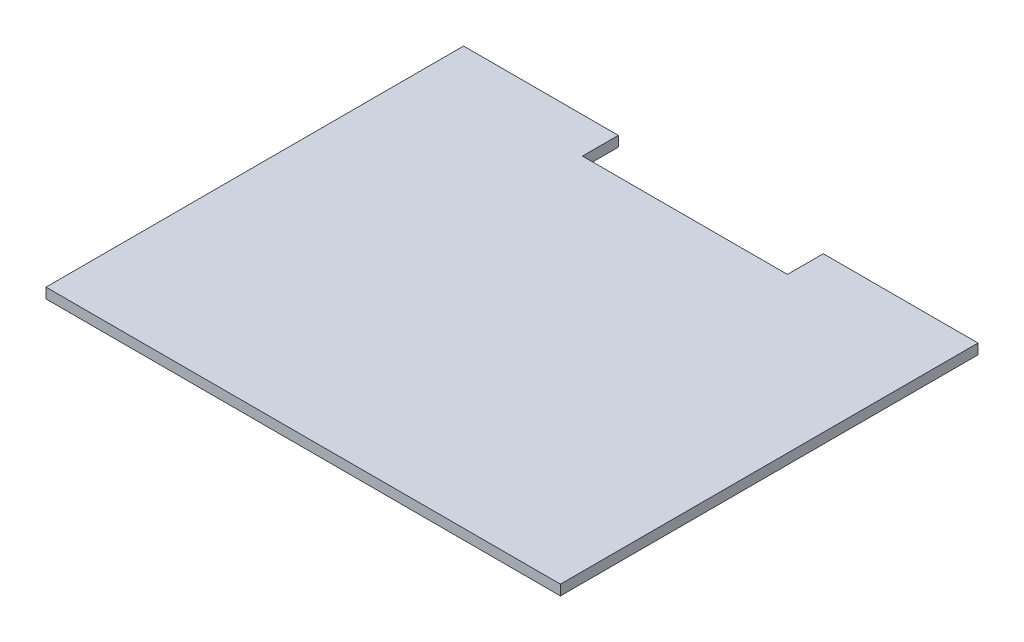
ISO-10303-21;
HEADER;
FILE_DESCRIPTION(('STEP AP214'),'2;1');
FILE_NAME('part.step','',(''),(''),'','','');
FILE_SCHEMA(('AUTOMOTIVE_DESIGN { 1 0 10303 214 1 1 1 1 }'));
ENDSEC;
DATA;
#1=APPLICATION_CONTEXT('core data for automotive mechanical design processes');
#2=APPLICATION_PROTOCOL_DEFINITION('international standard','automotive_design',2000,#1);
#3=PRODUCT_CONTEXT('',#1,'mechanical');
#4=PRODUCT('Part','Part','',(#3));
#5=PRODUCT_RELATED_PRODUCT_CATEGORY('part','',(#4));
#6=PRODUCT_DEFINITION_FORMATION('','',#4);
#7=PRODUCT_DEFINITION_CONTEXT('part definition',#1,'design');
#8=PRODUCT_DEFINITION('design','',#6,#7);
#9=PRODUCT_DEFINITION_SHAPE('','',#8);
#10=(LENGTH_UNIT() NAMED_UNIT(*) SI_UNIT(.MILLI.,.METRE.));
#11=(NAMED_UNIT(*) PLANE_ANGLE_UNIT() SI_UNIT($,.RADIAN.));
#12=(NAMED_UNIT(*) SI_UNIT($,.STERADIAN.) SOLID_ANGLE_UNIT());
#13=UNCERTAINTY_MEASURE_WITH_UNIT(LENGTH_MEASURE(1.E-05),#10,'distance_accuracy_value','');
#14=(GEOMETRIC_REPRESENTATION_CONTEXT(3) GLOBAL_UNCERTAINTY_ASSIGNED_CONTEXT((#13)) GLOBAL_UNIT_ASSIGNED_CONTEXT((#10,
#11,#12)) REPRESENTATION_CONTEXT('',''));
#15=CARTESIAN_POINT('',(0.,0.,0.));
#16=DIRECTION('',(0.,0.,1.));
#17=DIRECTION('',(1.,0.,0.));
#18=AXIS2_PLACEMENT_3D('',#15,#16,#17);
#19=CARTESIAN_POINT('',(50.2,0.,0.));
#20=DIRECTION('',(1.,0.,0.));
#21=DIRECTION('',(0.,1.,0.));
#22=AXIS2_PLACEMENT_3D('',#19,#20,#21);
#23=PLANE('',#22);
#24=DIRECTION('',(0.,0.,1.));
#25=VECTOR('',#24,1.);
#26=CARTESIAN_POINT('',(50.2,0.,0.));
#27=LINE('',#26,#25);
#28=CARTESIAN_POINT('',(50.2,0.,0.));
#29=VERTEX_POINT('',#28);
#30=CARTESIAN_POINT('',(50.2,0.,81.5));
#31=VERTEX_POINT('',#30);
#32=EDGE_CURVE('E110',#29,#31,#27,.T.);
#33=ORIENTED_EDGE('',*,*,#32,.F.);
#34=DIRECTION('',(0.,1.,0.));
#35=VECTOR('',#34,1.);
#36=CARTESIAN_POINT('',(50.2,0.,0.));
#37=LINE('',#36,#35);
#38=CARTESIAN_POINT('',(50.2,2.,0.));
#39=VERTEX_POINT('',#38);
#40=EDGE_CURVE('E10',#29,#39,#37,.T.);
#41=ORIENTED_EDGE('',*,*,#40,.T.);
#42=DIRECTION('',(0.,0.,1.));
#43=VECTOR('',#42,1.);
#44=CARTESIAN_POINT('',(50.2,2.,0.));
#45=LINE('',#44,#43);
#46=CARTESIAN_POINT('',(50.2,2.,81.5));
#47=VERTEX_POINT('',#46);
#48=EDGE_CURVE('E102',#39,#47,#45,.T.);
#49=ORIENTED_EDGE('',*,*,#48,.T.);
#50=DIRECTION('',(0.,1.,0.));
#51=VECTOR('',#50,1.);
#52=CARTESIAN_POINT('',(50.2,0.,81.5));
#53=LINE('',#52,#51);
#54=EDGE_CURVE('E140',#31,#47,#53,.T.);
#55=ORIENTED_EDGE('',*,*,#54,.F.);
#56=EDGE_LOOP('',(#33,#41,#49,#55));
#57=FACE_BOUND('',#56,.T.);
#58=ADVANCED_FACE('F16',(#57),#23,.T.);
#59=CARTESIAN_POINT('',(-50.2,0.,0.));
#60=DIRECTION('',(0.,0.,1.));
#61=DIRECTION('',(1.,0.,0.));
#62=AXIS2_PLACEMENT_3D('',#59,#60,#61);
#63=PLANE('',#62);
#64=ORIENTED_EDGE('',*,*,#40,.F.);
#65=DIRECTION('',(1.,0.,0.));
#66=VECTOR('',#65,1.);
#67=CARTESIAN_POINT('',(-50.2,0.,0.));
#68=LINE('',#67,#66);
#69=CARTESIAN_POINT('',(20.,0.,0.));
#70=VERTEX_POINT('',#69);
#71=EDGE_CURVE('E151',#70,#29,#68,.T.);
#72=ORIENTED_EDGE('',*,*,#71,.F.);
#73=DIRECTION('',(0.,1.,0.));
#74=VECTOR('',#73,1.);
#75=CARTESIAN_POINT('',(20.,-0.5,0.));
#76=LINE('',#75,#74);
#77=CARTESIAN_POINT('',(20.,2.,0.));
#78=VERTEX_POINT('',#77);
#79=EDGE_CURVE('E24',#70,#78,#76,.T.);
#80=ORIENTED_EDGE('',*,*,#79,.T.);
#81=DIRECTION('',(1.,0.,0.));
#82=VECTOR('',#81,1.);
#83=CARTESIAN_POINT('',(-50.2,2.,0.));
#84=LINE('',#83,#82);
#85=EDGE_CURVE('E115',#78,#39,#84,.T.);
#86=ORIENTED_EDGE('',*,*,#85,.T.);
#87=EDGE_LOOP('',(#64,#72,#80,#86));
#88=FACE_BOUND('',#87,.T.);
#89=ADVANCED_FACE('F114',(#88),#63,.F.);
#90=CARTESIAN_POINT('',(20.,-1.,-1.));
#91=DIRECTION('',(1.,0.,0.));
#92=DIRECTION('',(0.,1.,0.));
#93=AXIS2_PLACEMENT_3D('',#90,#91,#92);
#94=PLANE('',#93);
#95=DIRECTION('',(0.,0.,-1.));
#96=VECTOR('',#95,1.);
#97=CARTESIAN_POINT('',(20.,2.,-0.5));
#98=LINE('',#97,#96);
#99=CARTESIAN_POINT('',(20.,2.,7.));
#100=VERTEX_POINT('',#99);
#101=EDGE_CURVE('E117',#100,#78,#98,.T.);
#102=ORIENTED_EDGE('',*,*,#101,.T.);
#103=ORIENTED_EDGE('',*,*,#79,.F.);
#104=DIRECTION('',(0.,0.,-1.));
#105=VECTOR('',#104,1.);
#106=CARTESIAN_POINT('',(20.,0.,-0.5));
#107=LINE('',#106,#105);
#108=CARTESIAN_POINT('',(20.,0.,7.));
#109=VERTEX_POINT('',#108);
#110=EDGE_CURVE('E152',#109,#70,#107,.T.);
#111=ORIENTED_EDGE('',*,*,#110,.F.);
#112=DIRECTION('',(0.,1.,0.));
#113=VECTOR('',#112,1.);
#114=CARTESIAN_POINT('',(20.,-1.,7.));
#115=LINE('',#114,#113);
#116=EDGE_CURVE('E46',#109,#100,#115,.T.);
#117=ORIENTED_EDGE('',*,*,#116,.T.);
#118=EDGE_LOOP('',(#102,#103,#111,#117));
#119=FACE_BOUND('',#118,.T.);
#120=ADVANCED_FACE('F250',(#119),#94,.F.);
#121=CARTESIAN_POINT('',(-20.,-1.,7.));
#122=DIRECTION('',(0.,0.,1.));
#123=DIRECTION('',(1.,0.,0.));
#124=AXIS2_PLACEMENT_3D('',#121,#122,#123);
#125=PLANE('',#124);
#126=DIRECTION('',(1.,0.,0.));
#127=VECTOR('',#126,1.);
#128=CARTESIAN_POINT('',(-35.1,2.,7.));
#129=LINE('',#128,#127);
#130=CARTESIAN_POINT('',(-20.,2.,7.));
#131=VERTEX_POINT('',#130);
#132=EDGE_CURVE('E166',#131,#100,#129,.T.);
#133=ORIENTED_EDGE('',*,*,#132,.T.);
#134=ORIENTED_EDGE('',*,*,#116,.F.);
#135=DIRECTION('',(1.,0.,0.));
#136=VECTOR('',#135,1.);
#137=CARTESIAN_POINT('',(-35.1,0.,7.));
#138=LINE('',#137,#136);
#139=CARTESIAN_POINT('',(-20.,0.,7.));
#140=VERTEX_POINT('',#139);
#141=EDGE_CURVE('E147',#140,#109,#138,.T.);
#142=ORIENTED_EDGE('',*,*,#141,.F.);
#143=DIRECTION('',(0.,1.,0.));
#144=VECTOR('',#143,1.);
#145=CARTESIAN_POINT('',(-20.,-1.,7.));
#146=LINE('',#145,#144);
#147=EDGE_CURVE('E38',#140,#131,#146,.T.);
#148=ORIENTED_EDGE('',*,*,#147,.T.);
#149=EDGE_LOOP('',(#133,#134,#142,#148));
#150=FACE_BOUND('',#149,.T.);
#151=ADVANCED_FACE('F238',(#150),#125,.F.);
#152=CARTESIAN_POINT('',(-20.,-1.,-1.));
#153=DIRECTION('',(1.,0.,0.));
#154=DIRECTION('',(0.,1.,0.));
#155=AXIS2_PLACEMENT_3D('',#152,#153,#154);
#156=PLANE('',#155);
#157=ORIENTED_EDGE('',*,*,#147,.F.);
#158=DIRECTION('',(0.,0.,-1.));
#159=VECTOR('',#158,1.);
#160=CARTESIAN_POINT('',(-20.,0.,-0.5));
#161=LINE('',#160,#159);
#162=CARTESIAN_POINT('',(-20.,0.,0.));
#163=VERTEX_POINT('',#162);
#164=EDGE_CURVE('E148',#140,#163,#161,.T.);
#165=ORIENTED_EDGE('',*,*,#164,.T.);
#166=DIRECTION('',(0.,1.,0.));
#167=VECTOR('',#166,1.);
#168=CARTESIAN_POINT('',(-20.,-0.5,0.));
#169=LINE('',#168,#167);
#170=CARTESIAN_POINT('',(-20.,2.,0.));
#171=VERTEX_POINT('',#170);
#172=EDGE_CURVE('E176',#163,#171,#169,.T.);
#173=ORIENTED_EDGE('',*,*,#172,.T.);
#174=DIRECTION('',(0.,0.,-1.));
#175=VECTOR('',#174,1.);
#176=CARTESIAN_POINT('',(-20.,2.,-0.5));
#177=LINE('',#176,#175);
#178=EDGE_CURVE('E172',#131,#171,#177,.T.);
#179=ORIENTED_EDGE('',*,*,#178,.F.);
#180=EDGE_LOOP('',(#157,#165,#173,#179));
#181=FACE_BOUND('',#180,.T.);
#182=ADVANCED_FACE('F224',(#181),#156,.T.);
#183=CARTESIAN_POINT('',(-50.2,0.,0.));
#184=DIRECTION('',(0.,0.,1.));
#185=DIRECTION('',(1.,0.,0.));
#186=AXIS2_PLACEMENT_3D('',#183,#184,#185);
#187=PLANE('',#186);
#188=ORIENTED_EDGE('',*,*,#172,.F.);
#189=DIRECTION('',(1.,0.,0.));
#190=VECTOR('',#189,1.);
#191=CARTESIAN_POINT('',(-50.2,0.,0.));
#192=LINE('',#191,#190);
#193=CARTESIAN_POINT('',(-50.2,0.,0.));
#194=VERTEX_POINT('',#193);
#195=EDGE_CURVE('E160',#194,#163,#192,.T.);
#196=ORIENTED_EDGE('',*,*,#195,.F.);
#197=DIRECTION('',(0.,1.,0.));
#198=VECTOR('',#197,1.);
#199=CARTESIAN_POINT('',(-50.2,0.,0.));
#200=LINE('',#199,#198);
#201=CARTESIAN_POINT('',(-50.2,2.,0.));
#202=VERTEX_POINT('',#201);
#203=EDGE_CURVE('E138',#194,#202,#200,.T.);
#204=ORIENTED_EDGE('',*,*,#203,.T.);
#205=DIRECTION('',(1.,0.,0.));
#206=VECTOR('',#205,1.);
#207=CARTESIAN_POINT('',(-50.2,2.,0.));
#208=LINE('',#207,#206);
#209=EDGE_CURVE('E122',#202,#171,#208,.T.);
#210=ORIENTED_EDGE('',*,*,#209,.T.);
#211=EDGE_LOOP('',(#188,#196,#204,#210));
#212=FACE_BOUND('',#211,.T.);
#213=ADVANCED_FACE('F217',(#212),#187,.F.);
#214=CARTESIAN_POINT('',(-50.2,2.,0.));
#215=DIRECTION('',(0.,1.,0.));
#216=DIRECTION('',(1.,0.,0.));
#217=AXIS2_PLACEMENT_3D('',#214,#215,#216);
#218=PLANE('',#217);
#219=ORIENTED_EDGE('',*,*,#209,.F.);
#220=DIRECTION('',(0.,0.,1.));
#221=VECTOR('',#220,1.);
#222=CARTESIAN_POINT('',(-50.2,2.,0.));
#223=LINE('',#222,#221);
#224=CARTESIAN_POINT('',(-50.2,2.,81.5));
#225=VERTEX_POINT('',#224);
#226=EDGE_CURVE('E133',#202,#225,#223,.T.);
#227=ORIENTED_EDGE('',*,*,#226,.T.);
#228=DIRECTION('',(1.,0.,0.));
#229=VECTOR('',#228,1.);
#230=CARTESIAN_POINT('',(-50.2,2.,81.5));
#231=LINE('',#230,#229);
#232=EDGE_CURVE('E121',#225,#47,#231,.T.);
#233=ORIENTED_EDGE('',*,*,#232,.T.);
#234=ORIENTED_EDGE('',*,*,#48,.F.);
#235=ORIENTED_EDGE('',*,*,#85,.F.);
#236=ORIENTED_EDGE('',*,*,#101,.F.);
#237=ORIENTED_EDGE('',*,*,#132,.F.);
#238=ORIENTED_EDGE('',*,*,#178,.T.);
#239=EDGE_LOOP('',(#219,#227,#233,#234,#235,#236,#237,#238));
#240=FACE_BOUND('',#239,.T.);
#241=ADVANCED_FACE('F118',(#240),#218,.T.);
#242=CARTESIAN_POINT('',(-50.2,0.,81.5));
#243=DIRECTION('',(0.,0.,1.));
#244=DIRECTION('',(1.,0.,0.));
#245=AXIS2_PLACEMENT_3D('',#242,#243,#244);
#246=PLANE('',#245);
#247=DIRECTION('',(0.,1.,0.));
#248=VECTOR('',#247,1.);
#249=CARTESIAN_POINT('',(-50.2,0.,81.5));
#250=LINE('',#249,#248);
#251=CARTESIAN_POINT('',(-50.2,0.,81.5));
#252=VERTEX_POINT('',#251);
#253=EDGE_CURVE('E293',#252,#225,#250,.T.);
#254=ORIENTED_EDGE('',*,*,#253,.F.);
#255=DIRECTION('',(1.,0.,0.));
#256=VECTOR('',#255,1.);
#257=CARTESIAN_POINT('',(-50.2,0.,81.5));
#258=LINE('',#257,#256);
#259=EDGE_CURVE('E159',#252,#31,#258,.T.);
#260=ORIENTED_EDGE('',*,*,#259,.T.);
#261=ORIENTED_EDGE('',*,*,#54,.T.);
#262=ORIENTED_EDGE('',*,*,#232,.F.);
#263=EDGE_LOOP('',(#254,#260,#261,#262));
#264=FACE_BOUND('',#263,.T.);
#265=ADVANCED_FACE('F188',(#264),#246,.T.);
#266=CARTESIAN_POINT('',(-50.2,0.,0.));
#267=DIRECTION('',(0.,1.,0.));
#268=DIRECTION('',(1.,0.,0.));
#269=AXIS2_PLACEMENT_3D('',#266,#267,#268);
#270=PLANE('',#269);
#271=ORIENTED_EDGE('',*,*,#164,.F.);
#272=ORIENTED_EDGE('',*,*,#141,.T.);
#273=ORIENTED_EDGE('',*,*,#110,.T.);
#274=ORIENTED_EDGE('',*,*,#71,.T.);
#275=ORIENTED_EDGE('',*,*,#32,.T.);
#276=ORIENTED_EDGE('',*,*,#259,.F.);
#277=DIRECTION('',(0.,0.,1.));
#278=VECTOR('',#277,1.);
#279=CARTESIAN_POINT('',(-50.2,0.,0.));
#280=LINE('',#279,#278);
#281=EDGE_CURVE('E142',#194,#252,#280,.T.);
#282=ORIENTED_EDGE('',*,*,#281,.F.);
#283=ORIENTED_EDGE('',*,*,#195,.T.);
#284=EDGE_LOOP('',(#271,#272,#273,#274,#275,#276,#282,#283));
#285=FACE_BOUND('',#284,.T.);
#286=ADVANCED_FACE('F192',(#285),#270,.F.);
#287=CARTESIAN_POINT('',(-50.2,0.,0.));
#288=DIRECTION('',(1.,0.,0.));
#289=DIRECTION('',(0.,1.,0.));
#290=AXIS2_PLACEMENT_3D('',#287,#288,#289);
#291=PLANE('',#290);
#292=ORIENTED_EDGE('',*,*,#253,.T.);
#293=ORIENTED_EDGE('',*,*,#226,.F.);
#294=ORIENTED_EDGE('',*,*,#203,.F.);
#295=ORIENTED_EDGE('',*,*,#281,.T.);
#296=EDGE_LOOP('',(#292,#293,#294,#295));
#297=FACE_BOUND('',#296,.T.);
#298=ADVANCED_FACE('F205',(#297),#291,.F.);
#299=CLOSED_SHELL('',(#58,#89,#120,#151,#182,#213,#241,#265,#286,#298));
#300=MANIFOLD_SOLID_BREP('B1',#299);
#301=ADVANCED_BREP_SHAPE_REPRESENTATION('',(#18,#300),#14);
#302=SHAPE_DEFINITION_REPRESENTATION(#9,#301);
ENDSEC;
END-ISO-10303-21;
